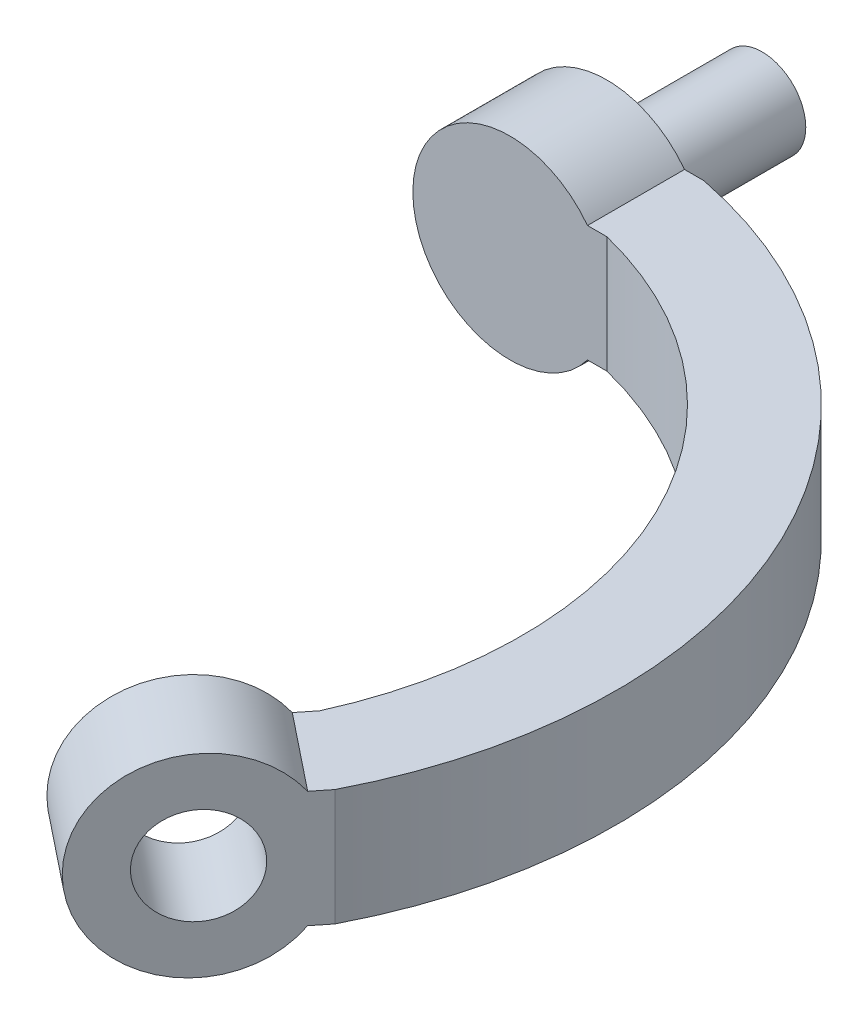
ISO-10303-21;
HEADER;
FILE_DESCRIPTION(('STEP AP214'),'2;1');
FILE_NAME('part.step','',(''),(''),'','','');
FILE_SCHEMA(('AUTOMOTIVE_DESIGN { 1 0 10303 214 1 1 1 1 }'));
ENDSEC;
DATA;
#1=APPLICATION_CONTEXT('core data for automotive mechanical design processes');
#2=APPLICATION_PROTOCOL_DEFINITION('international standard','automotive_design',2000,#1);
#3=PRODUCT_CONTEXT('',#1,'mechanical');
#4=PRODUCT('Part','Part','',(#3));
#5=PRODUCT_RELATED_PRODUCT_CATEGORY('part','',(#4));
#6=PRODUCT_DEFINITION_FORMATION('','',#4);
#7=PRODUCT_DEFINITION_CONTEXT('part definition',#1,'design');
#8=PRODUCT_DEFINITION('design','',#6,#7);
#9=PRODUCT_DEFINITION_SHAPE('','',#8);
#10=(LENGTH_UNIT() NAMED_UNIT(*) SI_UNIT(.MILLI.,.METRE.));
#11=(NAMED_UNIT(*) PLANE_ANGLE_UNIT() SI_UNIT($,.RADIAN.));
#12=(NAMED_UNIT(*) SI_UNIT($,.STERADIAN.) SOLID_ANGLE_UNIT());
#13=UNCERTAINTY_MEASURE_WITH_UNIT(LENGTH_MEASURE(1.E-05),#10,'distance_accuracy_value','');
#14=(GEOMETRIC_REPRESENTATION_CONTEXT(3) GLOBAL_UNCERTAINTY_ASSIGNED_CONTEXT((#13)) GLOBAL_UNIT_ASSIGNED_CONTEXT((#10,
#11,#12)) REPRESENTATION_CONTEXT('',''));
#15=CARTESIAN_POINT('',(0.,0.,0.));
#16=DIRECTION('',(0.,0.,1.));
#17=DIRECTION('',(1.,0.,0.));
#18=AXIS2_PLACEMENT_3D('',#15,#16,#17);
#19=CARTESIAN_POINT('',(0.,0.,5.));
#20=DIRECTION('',(0.,0.,-1.));
#21=DIRECTION('',(-1.,0.,0.));
#22=AXIS2_PLACEMENT_3D('',#19,#20,#21);
#23=CYLINDRICAL_SURFACE('',#22,5.);
#24=DIRECTION('',(0.,0.,-1.));
#25=VECTOR('',#24,1.);
#26=CARTESIAN_POINT('',(4.,-3.,5.));
#27=LINE('',#26,#25);
#28=CARTESIAN_POINT('',(4.,-3.,5.));
#29=VERTEX_POINT('',#28);
#30=CARTESIAN_POINT('',(4.,-3.,0.));
#31=VERTEX_POINT('',#30);
#32=EDGE_CURVE('E52',#29,#31,#27,.T.);
#33=ORIENTED_EDGE('',*,*,#32,.F.);
#34=CARTESIAN_POINT('',(0.,0.,5.));
#35=DIRECTION('',(0.,0.,1.));
#36=DIRECTION('',(1.,0.,0.));
#37=AXIS2_PLACEMENT_3D('',#34,#35,#36);
#38=CIRCLE('',#37,5.);
#39=CARTESIAN_POINT('',(4.,3.,5.));
#40=VERTEX_POINT('',#39);
#41=EDGE_CURVE('E11',#40,#29,#38,.T.);
#42=ORIENTED_EDGE('',*,*,#41,.F.);
#43=DIRECTION('',(0.,0.,-1.));
#44=VECTOR('',#43,1.);
#45=CARTESIAN_POINT('',(4.,3.,5.));
#46=LINE('',#45,#44);
#47=CARTESIAN_POINT('',(4.,3.,0.));
#48=VERTEX_POINT('',#47);
#49=EDGE_CURVE('E151',#48,#40,#46,.F.);
#50=ORIENTED_EDGE('',*,*,#49,.F.);
#51=CARTESIAN_POINT('',(0.,0.,0.));
#52=DIRECTION('',(0.,0.,1.));
#53=DIRECTION('',(1.,0.,0.));
#54=AXIS2_PLACEMENT_3D('',#51,#52,#53);
#55=CIRCLE('',#54,5.);
#56=EDGE_CURVE('E41',#48,#31,#55,.T.);
#57=ORIENTED_EDGE('',*,*,#56,.T.);
#58=EDGE_LOOP('',(#33,#42,#50,#57));
#59=FACE_BOUND('',#58,.T.);
#60=ADVANCED_FACE('F38',(#59),#23,.T.);
#61=CARTESIAN_POINT('',(0.,0.,5.));
#62=DIRECTION('',(0.,0.,1.));
#63=DIRECTION('',(1.,0.,0.));
#64=AXIS2_PLACEMENT_3D('',#61,#62,#63);
#65=PLANE('',#64);
#66=DIRECTION('',(1.,0.,0.));
#67=VECTOR('',#66,1.);
#68=CARTESIAN_POINT('',(2.,-3.,4.99999999999998));
#69=LINE('',#68,#67);
#70=CARTESIAN_POINT('',(4.9999999999999,-3.,4.99999999999998));
#71=VERTEX_POINT('',#70);
#72=EDGE_CURVE('E148',#29,#71,#69,.T.);
#73=ORIENTED_EDGE('',*,*,#72,.T.);
#74=DIRECTION('',(0.,1.,0.));
#75=VECTOR('',#74,1.);
#76=CARTESIAN_POINT('',(5.,-3.,4.99999999999998));
#77=LINE('',#76,#75);
#78=CARTESIAN_POINT('',(4.9999999999999,3.,4.99999999999998));
#79=VERTEX_POINT('',#78);
#80=EDGE_CURVE('E135',#71,#79,#77,.T.);
#81=ORIENTED_EDGE('',*,*,#80,.T.);
#82=DIRECTION('',(1.,0.,0.));
#83=VECTOR('',#82,1.);
#84=CARTESIAN_POINT('',(2.,3.,4.99999999999998));
#85=LINE('',#84,#83);
#86=EDGE_CURVE('E123',#40,#79,#85,.T.);
#87=ORIENTED_EDGE('',*,*,#86,.F.);
#88=ORIENTED_EDGE('',*,*,#41,.T.);
#89=EDGE_LOOP('',(#73,#81,#87,#88));
#90=FACE_BOUND('',#89,.T.);
#91=ADVANCED_FACE('F207',(#90),#65,.T.);
#92=CARTESIAN_POINT('',(0.,0.,0.));
#93=DIRECTION('',(0.,0.,1.));
#94=DIRECTION('',(1.,0.,0.));
#95=AXIS2_PLACEMENT_3D('',#92,#93,#94);
#96=PLANE('',#95);
#97=CARTESIAN_POINT('',(0.,0.,0.));
#98=DIRECTION('',(0.,0.,1.));
#99=DIRECTION('',(1.,0.,0.));
#100=AXIS2_PLACEMENT_3D('',#97,#98,#99);
#101=CIRCLE('',#100,2.25);
#102=CARTESIAN_POINT('',(2.25,0.,0.));
#103=VERTEX_POINT('',#102);
#104=EDGE_CURVE('E189',#103,#103,#101,.T.);
#105=ORIENTED_EDGE('',*,*,#104,.T.);
#106=EDGE_LOOP('',(#105));
#107=FACE_BOUND('',#106,.T.);
#108=ORIENTED_EDGE('',*,*,#56,.F.);
#109=DIRECTION('',(1.,0.,0.));
#110=VECTOR('',#109,1.);
#111=CARTESIAN_POINT('',(2.,3.,0.));
#112=LINE('',#111,#110);
#113=CARTESIAN_POINT('',(5.,3.,0.));
#114=VERTEX_POINT('',#113);
#115=EDGE_CURVE('E144',#48,#114,#112,.T.);
#116=ORIENTED_EDGE('',*,*,#115,.T.);
#117=DIRECTION('',(0.,-1.,0.));
#118=VECTOR('',#117,1.);
#119=CARTESIAN_POINT('',(5.,3.,0.));
#120=LINE('',#119,#118);
#121=CARTESIAN_POINT('',(5.,-3.,0.));
#122=VERTEX_POINT('',#121);
#123=EDGE_CURVE('E138',#114,#122,#120,.T.);
#124=ORIENTED_EDGE('',*,*,#123,.T.);
#125=DIRECTION('',(1.,0.,0.));
#126=VECTOR('',#125,1.);
#127=CARTESIAN_POINT('',(2.,-3.,0.));
#128=LINE('',#127,#126);
#129=EDGE_CURVE('E141',#31,#122,#128,.T.);
#130=ORIENTED_EDGE('',*,*,#129,.F.);
#131=EDGE_LOOP('',(#108,#116,#124,#130));
#132=FACE_BOUND('',#131,.T.);
#133=ADVANCED_FACE('F158',(#107,#132),#96,.F.);
#134=CARTESIAN_POINT('',(2.,-3.,0.));
#135=DIRECTION('',(0.,1.,0.));
#136=DIRECTION('',(0.,0.,1.));
#137=AXIS2_PLACEMENT_3D('',#134,#135,#136);
#138=PLANE('',#137);
#139=ORIENTED_EDGE('',*,*,#72,.F.);
#140=ORIENTED_EDGE('',*,*,#32,.T.);
#141=ORIENTED_EDGE('',*,*,#129,.T.);
#142=CARTESIAN_POINT('',(0.,-3.,25.));
#143=DIRECTION('',(0.,1.,0.));
#144=DIRECTION('',(0.,0.,1.));
#145=AXIS2_PLACEMENT_3D('',#142,#143,#144);
#146=CIRCLE('',#145,25.4950975679639);
#147=CARTESIAN_POINT('',(22.6635272369207,-3.,36.6775225618003));
#148=VERTEX_POINT('',#147);
#149=EDGE_CURVE('E125',#122,#148,#146,.F.);
#150=ORIENTED_EDGE('',*,*,#149,.T.);
#151=DIRECTION('',(0.623470308045553,0.,-0.781847027867717));
#152=VECTOR('',#151,1.);
#153=CARTESIAN_POINT('',(20.793116312784,-3.,39.0230636454034));
#154=LINE('',#153,#152);
#155=CARTESIAN_POINT('',(22.0400569288752,-3.,37.459369589668));
#156=VERTEX_POINT('',#155);
#157=EDGE_CURVE('E166',#156,#148,#154,.T.);
#158=ORIENTED_EDGE('',*,*,#157,.F.);
#159=DIRECTION('',(-0.781847027867717,0.,-0.623470308045554));
#160=VECTOR('',#159,1.);
#161=CARTESIAN_POINT('',(2.49388123218222,-3.,21.8726118885291));
#162=LINE('',#161,#160);
#163=CARTESIAN_POINT('',(18.1308217895366,-3.,34.3420180494402));
#164=VERTEX_POINT('',#163);
#165=EDGE_CURVE('E173',#156,#164,#162,.T.);
#166=ORIENTED_EDGE('',*,*,#165,.T.);
#167=DIRECTION('',(0.623470308045553,0.,-0.781847027867717));
#168=VECTOR('',#167,1.);
#169=CARTESIAN_POINT('',(16.8838811734455,-3.,35.9057121051756));
#170=LINE('',#169,#168);
#171=CARTESIAN_POINT('',(18.7542920975821,-3.,33.5601710215725));
#172=VERTEX_POINT('',#171);
#173=EDGE_CURVE('E118',#164,#172,#170,.T.);
#174=ORIENTED_EDGE('',*,*,#173,.T.);
#175=CARTESIAN_POINT('',(0.,-3.,25.));
#176=DIRECTION('',(0.,1.,0.));
#177=DIRECTION('',(0.,0.,1.));
#178=AXIS2_PLACEMENT_3D('',#175,#176,#177);
#179=CIRCLE('',#178,20.6155281280883);
#180=EDGE_CURVE('E105',#71,#172,#179,.F.);
#181=ORIENTED_EDGE('',*,*,#180,.F.);
#182=EDGE_LOOP('',(#139,#140,#141,#150,#158,#166,#174,#181));
#183=FACE_BOUND('',#182,.T.);
#184=ADVANCED_FACE('F165',(#183),#138,.F.);
#185=CARTESIAN_POINT('',(2.,3.,4.99999999999998));
#186=DIRECTION('',(0.,-1.,0.));
#187=DIRECTION('',(0.,0.,-1.));
#188=AXIS2_PLACEMENT_3D('',#185,#186,#187);
#189=PLANE('',#188);
#190=ORIENTED_EDGE('',*,*,#115,.F.);
#191=ORIENTED_EDGE('',*,*,#49,.T.);
#192=ORIENTED_EDGE('',*,*,#86,.T.);
#193=CARTESIAN_POINT('',(0.,3.,25.));
#194=DIRECTION('',(0.,1.,0.));
#195=DIRECTION('',(0.,0.,1.));
#196=AXIS2_PLACEMENT_3D('',#193,#194,#195);
#197=CIRCLE('',#196,20.6155281280883);
#198=CARTESIAN_POINT('',(18.7542920975821,3.,33.5601710215725));
#199=VERTEX_POINT('',#198);
#200=EDGE_CURVE('E102',#79,#199,#197,.F.);
#201=ORIENTED_EDGE('',*,*,#200,.T.);
#202=DIRECTION('',(0.623470308045553,0.,-0.781847027867717));
#203=VECTOR('',#202,1.);
#204=CARTESIAN_POINT('',(16.8838811734455,3.,35.9057121051756));
#205=LINE('',#204,#203);
#206=CARTESIAN_POINT('',(18.1308217895366,3.,34.3420180494402));
#207=VERTEX_POINT('',#206);
#208=EDGE_CURVE('E111',#207,#199,#205,.T.);
#209=ORIENTED_EDGE('',*,*,#208,.F.);
#210=DIRECTION('',(-0.781847027867717,0.,-0.623470308045554));
#211=VECTOR('',#210,1.);
#212=CARTESIAN_POINT('',(2.49388123218222,3.,21.8726118885291));
#213=LINE('',#212,#211);
#214=CARTESIAN_POINT('',(22.0400569288752,3.,37.459369589668));
#215=VERTEX_POINT('',#214);
#216=EDGE_CURVE('E176',#215,#207,#213,.T.);
#217=ORIENTED_EDGE('',*,*,#216,.F.);
#218=DIRECTION('',(0.623470308045553,0.,-0.781847027867717));
#219=VECTOR('',#218,1.);
#220=CARTESIAN_POINT('',(20.793116312784,3.,39.0230636454034));
#221=LINE('',#220,#219);
#222=CARTESIAN_POINT('',(22.6635272369207,3.,36.6775225618003));
#223=VERTEX_POINT('',#222);
#224=EDGE_CURVE('E117',#215,#223,#221,.T.);
#225=ORIENTED_EDGE('',*,*,#224,.T.);
#226=CARTESIAN_POINT('',(0.,3.,25.));
#227=DIRECTION('',(0.,1.,0.));
#228=DIRECTION('',(0.,0.,1.));
#229=AXIS2_PLACEMENT_3D('',#226,#227,#228);
#230=CIRCLE('',#229,25.4950975679639);
#231=EDGE_CURVE('E126',#114,#223,#230,.F.);
#232=ORIENTED_EDGE('',*,*,#231,.F.);
#233=EDGE_LOOP('',(#190,#191,#192,#201,#209,#217,#225,#232));
#234=FACE_BOUND('',#233,.T.);
#235=ADVANCED_FACE('F121',(#234),#189,.F.);
#236=CARTESIAN_POINT('',(0.,-3.,25.));
#237=DIRECTION('',(0.,1.,0.));
#238=DIRECTION('',(0.,0.,1.));
#239=AXIS2_PLACEMENT_3D('',#236,#237,#238);
#240=CYLINDRICAL_SURFACE('',#239,25.4950975679639);
#241=ORIENTED_EDGE('',*,*,#123,.F.);
#242=ORIENTED_EDGE('',*,*,#231,.T.);
#243=DIRECTION('',(0.,1.,0.));
#244=VECTOR('',#243,1.);
#245=CARTESIAN_POINT('',(22.6635272369207,-3.,36.6775225618003));
#246=LINE('',#245,#244);
#247=EDGE_CURVE('E108',#148,#223,#246,.T.);
#248=ORIENTED_EDGE('',*,*,#247,.F.);
#249=ORIENTED_EDGE('',*,*,#149,.F.);
#250=EDGE_LOOP('',(#241,#242,#248,#249));
#251=FACE_BOUND('',#250,.T.);
#252=ADVANCED_FACE('F164',(#251),#240,.T.);
#253=CARTESIAN_POINT('',(0.,-3.,25.));
#254=DIRECTION('',(0.,1.,0.));
#255=DIRECTION('',(0.,0.,1.));
#256=AXIS2_PLACEMENT_3D('',#253,#254,#255);
#257=CYLINDRICAL_SURFACE('',#256,20.6155281280883);
#258=DIRECTION('',(0.,1.,0.));
#259=VECTOR('',#258,1.);
#260=CARTESIAN_POINT('',(18.7542920975821,-3.,33.5601710215725));
#261=LINE('',#260,#259);
#262=EDGE_CURVE('E98',#172,#199,#261,.T.);
#263=ORIENTED_EDGE('',*,*,#262,.T.);
#264=ORIENTED_EDGE('',*,*,#200,.F.);
#265=ORIENTED_EDGE('',*,*,#80,.F.);
#266=ORIENTED_EDGE('',*,*,#180,.T.);
#267=EDGE_LOOP('',(#263,#264,#265,#266));
#268=FACE_BOUND('',#267,.T.);
#269=ADVANCED_FACE('F100',(#268),#257,.F.);
#270=CARTESIAN_POINT('',(20.793116312784,-3.,39.0230636454034));
#271=DIRECTION('',(-0.781847027867717,0.,-0.623470308045553));
#272=DIRECTION('',(-0.623470308045553,0.,0.781847027867718));
#273=AXIS2_PLACEMENT_3D('',#270,#271,#272);
#274=PLANE('',#273);
#275=CARTESIAN_POINT('',(19.5461756966929,0.,40.5867577011389));
#276=DIRECTION('',(-0.781847027867718,0.,-0.623470308045553));
#277=DIRECTION('',(-0.623470308045553,0.,0.781847027867718));
#278=AXIS2_PLACEMENT_3D('',#275,#276,#277);
#279=CIRCLE('',#278,2.5);
#280=CARTESIAN_POINT('',(17.9874999265791,0.,42.5413752708082));
#281=VERTEX_POINT('',#280);
#282=EDGE_CURVE('E182',#281,#281,#279,.T.);
#283=ORIENTED_EDGE('',*,*,#282,.T.);
#284=EDGE_LOOP('',(#283));
#285=FACE_BOUND('',#284,.T.);
#286=CARTESIAN_POINT('',(19.5461756966929,0.,40.5867577011388));
#287=DIRECTION('',(-0.781847027867717,0.,-0.623470308045554));
#288=DIRECTION('',(-0.623470308045554,0.,0.781847027867717));
#289=AXIS2_PLACEMENT_3D('',#286,#287,#288);
#290=CIRCLE('',#289,5.00000000000001);
#291=EDGE_CURVE('E172',#156,#215,#290,.T.);
#292=ORIENTED_EDGE('',*,*,#291,.F.);
#293=ORIENTED_EDGE('',*,*,#157,.T.);
#294=ORIENTED_EDGE('',*,*,#247,.T.);
#295=ORIENTED_EDGE('',*,*,#224,.F.);
#296=EDGE_LOOP('',(#292,#293,#294,#295));
#297=FACE_BOUND('',#296,.T.);
#298=ADVANCED_FACE('F170',(#285,#297),#274,.F.);
#299=CARTESIAN_POINT('',(16.8838811734455,3.,35.9057121051756));
#300=DIRECTION('',(0.781847027867717,0.,0.623470308045553));
#301=DIRECTION('',(0.623470308045553,0.,-0.781847027867718));
#302=AXIS2_PLACEMENT_3D('',#299,#300,#301);
#303=PLANE('',#302);
#304=CARTESIAN_POINT('',(15.6369405573544,0.,37.4694061609111));
#305=DIRECTION('',(-0.781847027867718,0.,-0.623470308045553));
#306=DIRECTION('',(-0.623470308045553,0.,0.781847027867718));
#307=AXIS2_PLACEMENT_3D('',#304,#305,#306);
#308=CIRCLE('',#307,2.5);
#309=CARTESIAN_POINT('',(14.0782647872405,0.,39.4240237305804));
#310=VERTEX_POINT('',#309);
#311=EDGE_CURVE('E183',#310,#310,#308,.T.);
#312=ORIENTED_EDGE('',*,*,#311,.F.);
#313=EDGE_LOOP('',(#312));
#314=FACE_BOUND('',#313,.T.);
#315=ORIENTED_EDGE('',*,*,#173,.F.);
#316=CARTESIAN_POINT('',(15.6369405573543,0.,37.4694061609111));
#317=DIRECTION('',(-0.781847027867717,0.,-0.623470308045554));
#318=DIRECTION('',(-0.623470308045554,0.,0.781847027867717));
#319=AXIS2_PLACEMENT_3D('',#316,#317,#318);
#320=CIRCLE('',#319,5.00000000000001);
#321=EDGE_CURVE('E114',#164,#207,#320,.T.);
#322=ORIENTED_EDGE('',*,*,#321,.T.);
#323=ORIENTED_EDGE('',*,*,#208,.T.);
#324=ORIENTED_EDGE('',*,*,#262,.F.);
#325=EDGE_LOOP('',(#315,#322,#323,#324));
#326=FACE_BOUND('',#325,.T.);
#327=ADVANCED_FACE('F112',(#314,#326),#303,.F.);
#328=CARTESIAN_POINT('',(0.,0.,25.));
#329=DIRECTION('',(-0.781847027867717,0.,-0.623470308045554));
#330=DIRECTION('',(-0.623470308045554,0.,0.781847027867717));
#331=AXIS2_PLACEMENT_3D('',#328,#329,#330);
#332=CYLINDRICAL_SURFACE('',#331,5.00000000000001);
#333=ORIENTED_EDGE('',*,*,#165,.F.);
#334=ORIENTED_EDGE('',*,*,#291,.T.);
#335=ORIENTED_EDGE('',*,*,#216,.T.);
#336=ORIENTED_EDGE('',*,*,#321,.F.);
#337=EDGE_LOOP('',(#333,#334,#335,#336));
#338=FACE_BOUND('',#337,.T.);
#339=ADVANCED_FACE('F231',(#338),#332,.T.);
#340=CARTESIAN_POINT('',(19.5461756966929,0.,40.5867577011389));
#341=DIRECTION('',(-0.781847027867718,0.,-0.623470308045553));
#342=DIRECTION('',(-0.623470308045553,0.,0.781847027867718));
#343=AXIS2_PLACEMENT_3D('',#340,#341,#342);
#344=CYLINDRICAL_SURFACE('',#343,2.5);
#345=ORIENTED_EDGE('',*,*,#282,.F.);
#346=EDGE_LOOP('',(#345));
#347=FACE_BOUND('',#346,.T.);
#348=ORIENTED_EDGE('',*,*,#311,.T.);
#349=EDGE_LOOP('',(#348));
#350=FACE_BOUND('',#349,.T.);
#351=ADVANCED_FACE('F204',(#347,#350),#344,.F.);
#352=CARTESIAN_POINT('',(0.,0.,-8.));
#353=DIRECTION('',(0.,0.,1.));
#354=DIRECTION('',(1.,0.,0.));
#355=AXIS2_PLACEMENT_3D('',#352,#353,#354);
#356=CYLINDRICAL_SURFACE('',#355,2.25);
#357=CARTESIAN_POINT('',(0.,0.,-8.));
#358=DIRECTION('',(0.,0.,1.));
#359=DIRECTION('',(1.,0.,0.));
#360=AXIS2_PLACEMENT_3D('',#357,#358,#359);
#361=CIRCLE('',#360,2.25);
#362=CARTESIAN_POINT('',(2.25,0.,-8.));
#363=VERTEX_POINT('',#362);
#364=EDGE_CURVE('E186',#363,#363,#361,.T.);
#365=ORIENTED_EDGE('',*,*,#364,.T.);
#366=EDGE_LOOP('',(#365));
#367=FACE_BOUND('',#366,.T.);
#368=ORIENTED_EDGE('',*,*,#104,.F.);
#369=EDGE_LOOP('',(#368));
#370=FACE_BOUND('',#369,.T.);
#371=ADVANCED_FACE('F195',(#367,#370),#356,.T.);
#372=CARTESIAN_POINT('',(0.,0.,-8.));
#373=DIRECTION('',(0.,0.,1.));
#374=DIRECTION('',(1.,0.,0.));
#375=AXIS2_PLACEMENT_3D('',#372,#373,#374);
#376=PLANE('',#375);
#377=ORIENTED_EDGE('',*,*,#364,.F.);
#378=EDGE_LOOP('',(#377));
#379=FACE_BOUND('',#378,.T.);
#380=ADVANCED_FACE('F198',(#379),#376,.F.);
#381=CLOSED_SHELL('',(#60,#91,#133,#184,#235,#252,#269,#298,#327,#339,#351,#371,#380));
#382=MANIFOLD_SOLID_BREP('B2',#381);
#383=ADVANCED_BREP_SHAPE_REPRESENTATION('',(#18,#382),#14);
#384=SHAPE_DEFINITION_REPRESENTATION(#9,#383);
ENDSEC;
END-ISO-10303-21;
